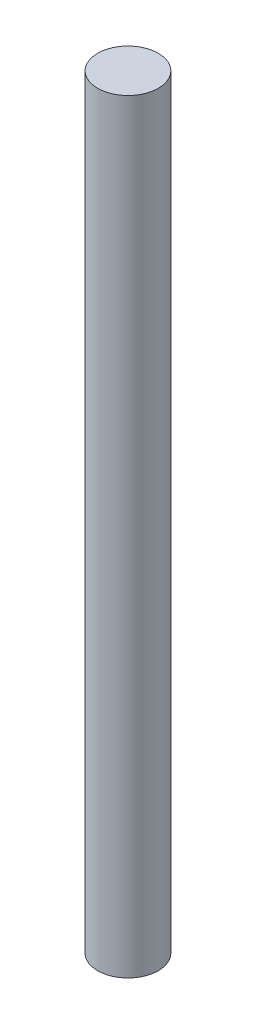
ISO-10303-21;
HEADER;
FILE_DESCRIPTION(('STEP AP214'),'2;1');
FILE_NAME('part.step','',(''),(''),'','','');
FILE_SCHEMA(('AUTOMOTIVE_DESIGN { 1 0 10303 214 1 1 1 1 }'));
ENDSEC;
DATA;
#1=APPLICATION_CONTEXT('core data for automotive mechanical design processes');
#2=APPLICATION_PROTOCOL_DEFINITION('international standard','automotive_design',2000,#1);
#3=PRODUCT_CONTEXT('',#1,'mechanical');
#4=PRODUCT('Part','Part','',(#3));
#5=PRODUCT_RELATED_PRODUCT_CATEGORY('part','',(#4));
#6=PRODUCT_DEFINITION_FORMATION('','',#4);
#7=PRODUCT_DEFINITION_CONTEXT('part definition',#1,'design');
#8=PRODUCT_DEFINITION('design','',#6,#7);
#9=PRODUCT_DEFINITION_SHAPE('','',#8);
#10=(LENGTH_UNIT() NAMED_UNIT(*) SI_UNIT(.MILLI.,.METRE.));
#11=(NAMED_UNIT(*) PLANE_ANGLE_UNIT() SI_UNIT($,.RADIAN.));
#12=(NAMED_UNIT(*) SI_UNIT($,.STERADIAN.) SOLID_ANGLE_UNIT());
#13=UNCERTAINTY_MEASURE_WITH_UNIT(LENGTH_MEASURE(1.E-05),#10,'distance_accuracy_value','');
#14=(GEOMETRIC_REPRESENTATION_CONTEXT(3) GLOBAL_UNCERTAINTY_ASSIGNED_CONTEXT((#13)) GLOBAL_UNIT_ASSIGNED_CONTEXT((#10,
#11,#12)) REPRESENTATION_CONTEXT('',''));
#15=CARTESIAN_POINT('',(0.,0.,0.));
#16=DIRECTION('',(0.,0.,1.));
#17=DIRECTION('',(1.,0.,0.));
#18=AXIS2_PLACEMENT_3D('',#15,#16,#17);
#19=CARTESIAN_POINT('',(0.,80.,0.));
#20=DIRECTION('',(0.,-1.,0.));
#21=DIRECTION('',(0.,0.,-1.));
#22=AXIS2_PLACEMENT_3D('',#19,#20,#21);
#23=CYLINDRICAL_SURFACE('',#22,3.175);
#24=CARTESIAN_POINT('',(0.,80.,0.));
#25=DIRECTION('',(0.,1.,0.));
#26=DIRECTION('',(0.,0.,1.));
#27=AXIS2_PLACEMENT_3D('',#24,#25,#26);
#28=CIRCLE('',#27,3.175);
#29=CARTESIAN_POINT('',(0.,80.,3.175));
#30=VERTEX_POINT('',#29);
#31=EDGE_CURVE('E10',#30,#30,#28,.T.);
#32=ORIENTED_EDGE('',*,*,#31,.F.);
#33=EDGE_LOOP('',(#32));
#34=FACE_BOUND('',#33,.T.);
#35=CARTESIAN_POINT('',(0.,0.,0.));
#36=DIRECTION('',(0.,1.,0.));
#37=DIRECTION('',(0.,0.,1.));
#38=AXIS2_PLACEMENT_3D('',#35,#36,#37);
#39=CIRCLE('',#38,3.175);
#40=CARTESIAN_POINT('',(0.,0.,3.175));
#41=VERTEX_POINT('',#40);
#42=EDGE_CURVE('E34',#41,#41,#39,.T.);
#43=ORIENTED_EDGE('',*,*,#42,.T.);
#44=EDGE_LOOP('',(#43));
#45=FACE_BOUND('',#44,.T.);
#46=ADVANCED_FACE('F31',(#34,#45),#23,.T.);
#47=CARTESIAN_POINT('',(0.,80.,0.));
#48=DIRECTION('',(0.,1.,0.));
#49=DIRECTION('',(0.,0.,1.));
#50=AXIS2_PLACEMENT_3D('',#47,#48,#49);
#51=PLANE('',#50);
#52=ORIENTED_EDGE('',*,*,#31,.T.);
#53=EDGE_LOOP('',(#52));
#54=FACE_BOUND('',#53,.T.);
#55=ADVANCED_FACE('F46',(#54),#51,.T.);
#56=CARTESIAN_POINT('',(0.,0.,0.));
#57=DIRECTION('',(0.,1.,0.));
#58=DIRECTION('',(0.,0.,1.));
#59=AXIS2_PLACEMENT_3D('',#56,#57,#58);
#60=PLANE('',#59);
#61=ORIENTED_EDGE('',*,*,#42,.F.);
#62=EDGE_LOOP('',(#61));
#63=FACE_BOUND('',#62,.T.);
#64=ADVANCED_FACE('F44',(#63),#60,.F.);
#65=CLOSED_SHELL('',(#46,#55,#64));
#66=MANIFOLD_SOLID_BREP('B2',#65);
#67=ADVANCED_BREP_SHAPE_REPRESENTATION('',(#18,#66),#14);
#68=SHAPE_DEFINITION_REPRESENTATION(#9,#67);
ENDSEC;
END-ISO-10303-21;
